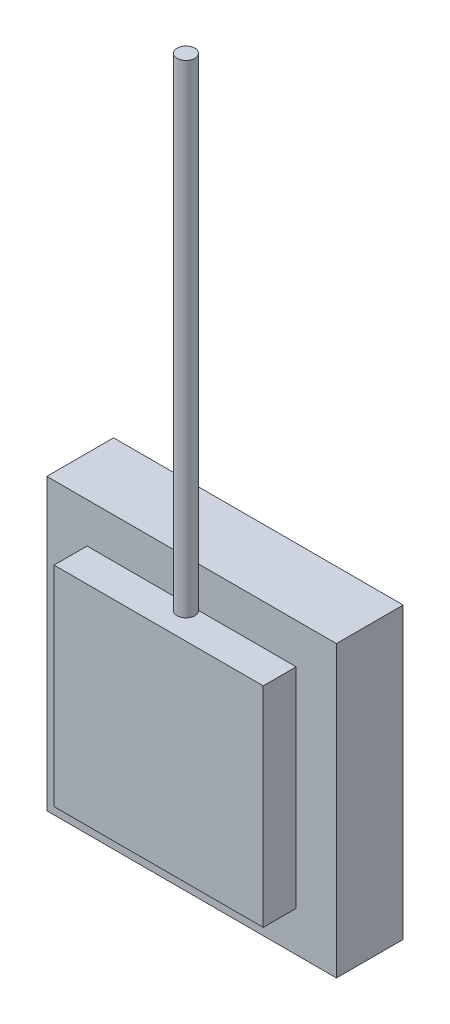
ISO-10303-21;
HEADER;
FILE_DESCRIPTION(('STEP AP214'),'2;1');
FILE_NAME('part.step','',(''),(''),'','','');
FILE_SCHEMA(('AUTOMOTIVE_DESIGN { 1 0 10303 214 1 1 1 1 }'));
ENDSEC;
DATA;
#1=APPLICATION_CONTEXT('core data for automotive mechanical design processes');
#2=APPLICATION_PROTOCOL_DEFINITION('international standard','automotive_design',2000,#1);
#3=PRODUCT_CONTEXT('',#1,'mechanical');
#4=PRODUCT('Part','Part','',(#3));
#5=PRODUCT_RELATED_PRODUCT_CATEGORY('part','',(#4));
#6=PRODUCT_DEFINITION_FORMATION('','',#4);
#7=PRODUCT_DEFINITION_CONTEXT('part definition',#1,'design');
#8=PRODUCT_DEFINITION('design','',#6,#7);
#9=PRODUCT_DEFINITION_SHAPE('','',#8);
#10=(LENGTH_UNIT() NAMED_UNIT(*) SI_UNIT(.MILLI.,.METRE.));
#11=(NAMED_UNIT(*) PLANE_ANGLE_UNIT() SI_UNIT($,.RADIAN.));
#12=(NAMED_UNIT(*) SI_UNIT($,.STERADIAN.) SOLID_ANGLE_UNIT());
#13=UNCERTAINTY_MEASURE_WITH_UNIT(LENGTH_MEASURE(1.E-05),#10,'distance_accuracy_value','');
#14=(GEOMETRIC_REPRESENTATION_CONTEXT(3) GLOBAL_UNCERTAINTY_ASSIGNED_CONTEXT((#13)) GLOBAL_UNIT_ASSIGNED_CONTEXT((#10,
#11,#12)) REPRESENTATION_CONTEXT('',''));
#15=CARTESIAN_POINT('',(0.,0.,0.));
#16=DIRECTION('',(0.,0.,1.));
#17=DIRECTION('',(1.,0.,0.));
#18=AXIS2_PLACEMENT_3D('',#15,#16,#17);
#19=CARTESIAN_POINT('',(0.,0.,4.15));
#20=DIRECTION('',(0.,0.,-1.));
#21=DIRECTION('',(-1.,0.,0.));
#22=AXIS2_PLACEMENT_3D('',#19,#20,#21);
#23=PLANE('',#22);
#24=DIRECTION('',(0.,-1.,0.));
#25=VECTOR('',#24,1.);
#26=CARTESIAN_POINT('',(9.42776641817179,45.5,4.15));
#27=LINE('',#26,#25);
#28=CARTESIAN_POINT('',(9.42776641817179,15.5,4.15));
#29=VERTEX_POINT('',#28);
#30=CARTESIAN_POINT('',(9.42776641817179,18.,4.15));
#31=VERTEX_POINT('',#30);
#32=EDGE_CURVE('E124',#29,#31,#27,.F.);
#33=ORIENTED_EDGE('',*,*,#32,.F.);
#34=DIRECTION('',(-1.,0.,0.));
#35=VECTOR('',#34,1.);
#36=CARTESIAN_POINT('',(2.5,15.5,4.15));
#37=LINE('',#36,#35);
#38=CARTESIAN_POINT('',(15.5,15.5,4.15));
#39=VERTEX_POINT('',#38);
#40=EDGE_CURVE('E113',#39,#29,#37,.T.);
#41=ORIENTED_EDGE('',*,*,#40,.F.);
#42=DIRECTION('',(0.,1.,0.));
#43=VECTOR('',#42,1.);
#44=CARTESIAN_POINT('',(15.5,15.5,4.15));
#45=LINE('',#44,#43);
#46=CARTESIAN_POINT('',(15.5,2.5,4.15));
#47=VERTEX_POINT('',#46);
#48=EDGE_CURVE('E155',#47,#39,#45,.T.);
#49=ORIENTED_EDGE('',*,*,#48,.F.);
#50=DIRECTION('',(1.,0.,0.));
#51=VECTOR('',#50,1.);
#52=CARTESIAN_POINT('',(2.5,2.5,4.15));
#53=LINE('',#52,#51);
#54=CARTESIAN_POINT('',(2.5,2.5,4.15));
#55=VERTEX_POINT('',#54);
#56=EDGE_CURVE('E152',#55,#47,#53,.T.);
#57=ORIENTED_EDGE('',*,*,#56,.F.);
#58=DIRECTION('',(0.,-1.,0.));
#59=VECTOR('',#58,1.);
#60=CARTESIAN_POINT('',(2.5,15.5,4.15));
#61=LINE('',#60,#59);
#62=CARTESIAN_POINT('',(2.5,15.5,4.15));
#63=VERTEX_POINT('',#62);
#64=EDGE_CURVE('E138',#63,#55,#61,.T.);
#65=ORIENTED_EDGE('',*,*,#64,.F.);
#66=CARTESIAN_POINT('',(8.67148678845415,15.5,4.15));
#67=VERTEX_POINT('',#66);
#68=EDGE_CURVE('E121',#67,#63,#37,.T.);
#69=ORIENTED_EDGE('',*,*,#68,.F.);
#70=DIRECTION('',(0.,-1.,0.));
#71=VECTOR('',#70,1.);
#72=CARTESIAN_POINT('',(8.67148678845415,45.5,4.15));
#73=LINE('',#72,#71);
#74=CARTESIAN_POINT('',(8.67148678845415,18.,4.15));
#75=VERTEX_POINT('',#74);
#76=EDGE_CURVE('E50',#75,#67,#73,.T.);
#77=ORIENTED_EDGE('',*,*,#76,.F.);
#78=DIRECTION('',(-1.,0.,0.));
#79=VECTOR('',#78,1.);
#80=CARTESIAN_POINT('',(0.,18.,4.15));
#81=LINE('',#80,#79);
#82=CARTESIAN_POINT('',(0.,18.,4.15));
#83=VERTEX_POINT('',#82);
#84=EDGE_CURVE('E175',#75,#83,#81,.T.);
#85=ORIENTED_EDGE('',*,*,#84,.T.);
#86=DIRECTION('',(0.,-1.,0.));
#87=VECTOR('',#86,1.);
#88=CARTESIAN_POINT('',(0.,0.,4.15));
#89=LINE('',#88,#87);
#90=CARTESIAN_POINT('',(0.,0.,4.15));
#91=VERTEX_POINT('',#90);
#92=EDGE_CURVE('E167',#83,#91,#89,.T.);
#93=ORIENTED_EDGE('',*,*,#92,.T.);
#94=DIRECTION('',(1.,0.,0.));
#95=VECTOR('',#94,1.);
#96=CARTESIAN_POINT('',(0.,0.,4.15));
#97=LINE('',#96,#95);
#98=CARTESIAN_POINT('',(18.,0.,4.15));
#99=VERTEX_POINT('',#98);
#100=EDGE_CURVE('E170',#91,#99,#97,.T.);
#101=ORIENTED_EDGE('',*,*,#100,.T.);
#102=DIRECTION('',(0.,1.,0.));
#103=VECTOR('',#102,1.);
#104=CARTESIAN_POINT('',(18.,0.,4.15));
#105=LINE('',#104,#103);
#106=CARTESIAN_POINT('',(18.,18.,4.15));
#107=VERTEX_POINT('',#106);
#108=EDGE_CURVE('E173',#99,#107,#105,.T.);
#109=ORIENTED_EDGE('',*,*,#108,.T.);
#110=EDGE_CURVE('E125',#107,#31,#81,.T.);
#111=ORIENTED_EDGE('',*,*,#110,.T.);
#112=EDGE_LOOP('',(#33,#41,#49,#57,#65,#69,#77,#85,#93,#101,#109,#111));
#113=FACE_BOUND('',#112,.T.);
#114=ADVANCED_FACE('F35',(#113),#23,.F.);
#115=CARTESIAN_POINT('',(0.,0.,4.15));
#116=DIRECTION('',(1.,0.,0.));
#117=DIRECTION('',(0.,0.,-1.));
#118=AXIS2_PLACEMENT_3D('',#115,#116,#117);
#119=PLANE('',#118);
#120=DIRECTION('',(0.,-1.,0.));
#121=VECTOR('',#120,1.);
#122=CARTESIAN_POINT('',(0.,0.,0.));
#123=LINE('',#122,#121);
#124=CARTESIAN_POINT('',(0.,18.,0.));
#125=VERTEX_POINT('',#124);
#126=CARTESIAN_POINT('',(0.,0.,0.));
#127=VERTEX_POINT('',#126);
#128=EDGE_CURVE('E166',#125,#127,#123,.T.);
#129=ORIENTED_EDGE('',*,*,#128,.T.);
#130=DIRECTION('',(0.,0.,-1.));
#131=VECTOR('',#130,1.);
#132=CARTESIAN_POINT('',(0.,0.,4.15));
#133=LINE('',#132,#131);
#134=EDGE_CURVE('E43',#91,#127,#133,.T.);
#135=ORIENTED_EDGE('',*,*,#134,.F.);
#136=ORIENTED_EDGE('',*,*,#92,.F.);
#137=DIRECTION('',(0.,0.,-1.));
#138=VECTOR('',#137,1.);
#139=CARTESIAN_POINT('',(0.,18.,4.15));
#140=LINE('',#139,#138);
#141=EDGE_CURVE('E177',#83,#125,#140,.T.);
#142=ORIENTED_EDGE('',*,*,#141,.T.);
#143=EDGE_LOOP('',(#129,#135,#136,#142));
#144=FACE_BOUND('',#143,.T.);
#145=ADVANCED_FACE('F37',(#144),#119,.F.);
#146=CARTESIAN_POINT('',(0.,0.,4.15));
#147=DIRECTION('',(0.,1.,0.));
#148=DIRECTION('',(0.,0.,1.));
#149=AXIS2_PLACEMENT_3D('',#146,#147,#148);
#150=PLANE('',#149);
#151=DIRECTION('',(1.,0.,0.));
#152=VECTOR('',#151,1.);
#153=CARTESIAN_POINT('',(0.,0.,0.));
#154=LINE('',#153,#152);
#155=CARTESIAN_POINT('',(18.,0.,0.));
#156=VERTEX_POINT('',#155);
#157=EDGE_CURVE('E180',#127,#156,#154,.T.);
#158=ORIENTED_EDGE('',*,*,#157,.T.);
#159=DIRECTION('',(0.,0.,-1.));
#160=VECTOR('',#159,1.);
#161=CARTESIAN_POINT('',(18.,0.,4.15));
#162=LINE('',#161,#160);
#163=EDGE_CURVE('E190',#99,#156,#162,.T.);
#164=ORIENTED_EDGE('',*,*,#163,.F.);
#165=ORIENTED_EDGE('',*,*,#100,.F.);
#166=ORIENTED_EDGE('',*,*,#134,.T.);
#167=EDGE_LOOP('',(#158,#164,#165,#166));
#168=FACE_BOUND('',#167,.T.);
#169=ADVANCED_FACE('F195',(#168),#150,.F.);
#170=CARTESIAN_POINT('',(18.,0.,4.15));
#171=DIRECTION('',(-1.,0.,0.));
#172=DIRECTION('',(0.,0.,1.));
#173=AXIS2_PLACEMENT_3D('',#170,#171,#172);
#174=PLANE('',#173);
#175=DIRECTION('',(0.,1.,0.));
#176=VECTOR('',#175,1.);
#177=CARTESIAN_POINT('',(18.,0.,0.));
#178=LINE('',#177,#176);
#179=CARTESIAN_POINT('',(18.,18.,0.));
#180=VERTEX_POINT('',#179);
#181=EDGE_CURVE('E182',#156,#180,#178,.T.);
#182=ORIENTED_EDGE('',*,*,#181,.T.);
#183=DIRECTION('',(0.,0.,-1.));
#184=VECTOR('',#183,1.);
#185=CARTESIAN_POINT('',(18.,18.,4.15));
#186=LINE('',#185,#184);
#187=EDGE_CURVE('E187',#107,#180,#186,.T.);
#188=ORIENTED_EDGE('',*,*,#187,.F.);
#189=ORIENTED_EDGE('',*,*,#108,.F.);
#190=ORIENTED_EDGE('',*,*,#163,.T.);
#191=EDGE_LOOP('',(#182,#188,#189,#190));
#192=FACE_BOUND('',#191,.T.);
#193=ADVANCED_FACE('F207',(#192),#174,.F.);
#194=CARTESIAN_POINT('',(0.,18.,4.15));
#195=DIRECTION('',(0.,-1.,0.));
#196=DIRECTION('',(0.,0.,-1.));
#197=AXIS2_PLACEMENT_3D('',#194,#195,#196);
#198=PLANE('',#197);
#199=CARTESIAN_POINT('',(9.04962660331297,18.,4.55163239860488));
#200=DIRECTION('',(0.,-1.,0.));
#201=DIRECTION('',(0.,0.,-1.));
#202=AXIS2_PLACEMENT_3D('',#199,#200,#201);
#203=CIRCLE('',#202,0.551632398604884);
#204=EDGE_CURVE('E57',#31,#75,#203,.F.);
#205=ORIENTED_EDGE('',*,*,#204,.F.);
#206=ORIENTED_EDGE('',*,*,#110,.F.);
#207=ORIENTED_EDGE('',*,*,#187,.T.);
#208=DIRECTION('',(-1.,0.,0.));
#209=VECTOR('',#208,1.);
#210=CARTESIAN_POINT('',(0.,18.,0.));
#211=LINE('',#210,#209);
#212=EDGE_CURVE('E171',#180,#125,#211,.T.);
#213=ORIENTED_EDGE('',*,*,#212,.T.);
#214=ORIENTED_EDGE('',*,*,#141,.F.);
#215=ORIENTED_EDGE('',*,*,#84,.F.);
#216=EDGE_LOOP('',(#205,#206,#207,#213,#214,#215));
#217=FACE_BOUND('',#216,.T.);
#218=ADVANCED_FACE('F209',(#217),#198,.F.);
#219=CARTESIAN_POINT('',(0.,0.,0.));
#220=DIRECTION('',(0.,0.,-1.));
#221=DIRECTION('',(-1.,0.,0.));
#222=AXIS2_PLACEMENT_3D('',#219,#220,#221);
#223=PLANE('',#222);
#224=CARTESIAN_POINT('',(10.,9.,0.));
#225=DIRECTION('',(0.,0.,-1.));
#226=DIRECTION('',(-1.,0.,0.));
#227=AXIS2_PLACEMENT_3D('',#224,#225,#226);
#228=CIRCLE('',#227,1.5);
#229=CARTESIAN_POINT('',(8.5,9.,0.));
#230=VERTEX_POINT('',#229);
#231=EDGE_CURVE('E127',#230,#230,#228,.T.);
#232=ORIENTED_EDGE('',*,*,#231,.F.);
#233=EDGE_LOOP('',(#232));
#234=FACE_BOUND('',#233,.T.);
#235=ORIENTED_EDGE('',*,*,#128,.F.);
#236=ORIENTED_EDGE('',*,*,#212,.F.);
#237=ORIENTED_EDGE('',*,*,#181,.F.);
#238=ORIENTED_EDGE('',*,*,#157,.F.);
#239=EDGE_LOOP('',(#235,#236,#237,#238));
#240=FACE_BOUND('',#239,.T.);
#241=ADVANCED_FACE('F203',(#234,#240),#223,.T.);
#242=CARTESIAN_POINT('',(2.5,15.5,6.2));
#243=DIRECTION('',(1.,0.,0.));
#244=DIRECTION('',(0.,0.,-1.));
#245=AXIS2_PLACEMENT_3D('',#242,#243,#244);
#246=PLANE('',#245);
#247=ORIENTED_EDGE('',*,*,#64,.T.);
#248=DIRECTION('',(0.,0.,-1.));
#249=VECTOR('',#248,1.);
#250=CARTESIAN_POINT('',(2.5,2.5,6.2));
#251=LINE('',#250,#249);
#252=CARTESIAN_POINT('',(2.5,2.5,6.2));
#253=VERTEX_POINT('',#252);
#254=EDGE_CURVE('E163',#253,#55,#251,.T.);
#255=ORIENTED_EDGE('',*,*,#254,.F.);
#256=DIRECTION('',(0.,-1.,0.));
#257=VECTOR('',#256,1.);
#258=CARTESIAN_POINT('',(2.5,15.5,6.2));
#259=LINE('',#258,#257);
#260=CARTESIAN_POINT('',(2.5,15.5,6.2));
#261=VERTEX_POINT('',#260);
#262=EDGE_CURVE('E120',#261,#253,#259,.T.);
#263=ORIENTED_EDGE('',*,*,#262,.F.);
#264=DIRECTION('',(0.,0.,-1.));
#265=VECTOR('',#264,1.);
#266=CARTESIAN_POINT('',(2.5,15.5,6.2));
#267=LINE('',#266,#265);
#268=EDGE_CURVE('E149',#261,#63,#267,.T.);
#269=ORIENTED_EDGE('',*,*,#268,.T.);
#270=EDGE_LOOP('',(#247,#255,#263,#269));
#271=FACE_BOUND('',#270,.T.);
#272=ADVANCED_FACE('F216',(#271),#246,.F.);
#273=CARTESIAN_POINT('',(2.5,2.5,6.2));
#274=DIRECTION('',(0.,1.,0.));
#275=DIRECTION('',(-1.,0.,0.));
#276=AXIS2_PLACEMENT_3D('',#273,#274,#275);
#277=PLANE('',#276);
#278=ORIENTED_EDGE('',*,*,#56,.T.);
#279=DIRECTION('',(0.,0.,-1.));
#280=VECTOR('',#279,1.);
#281=CARTESIAN_POINT('',(15.5,2.5,6.2));
#282=LINE('',#281,#280);
#283=CARTESIAN_POINT('',(15.5,2.5,6.2));
#284=VERTEX_POINT('',#283);
#285=EDGE_CURVE('E160',#284,#47,#282,.T.);
#286=ORIENTED_EDGE('',*,*,#285,.F.);
#287=DIRECTION('',(1.,0.,0.));
#288=VECTOR('',#287,1.);
#289=CARTESIAN_POINT('',(2.5,2.5,6.2));
#290=LINE('',#289,#288);
#291=EDGE_CURVE('E143',#253,#284,#290,.T.);
#292=ORIENTED_EDGE('',*,*,#291,.F.);
#293=ORIENTED_EDGE('',*,*,#254,.T.);
#294=EDGE_LOOP('',(#278,#286,#292,#293));
#295=FACE_BOUND('',#294,.T.);
#296=ADVANCED_FACE('F228',(#295),#277,.F.);
#297=CARTESIAN_POINT('',(15.5,15.5,6.2));
#298=DIRECTION('',(-1.,0.,0.));
#299=DIRECTION('',(0.,0.,1.));
#300=AXIS2_PLACEMENT_3D('',#297,#298,#299);
#301=PLANE('',#300);
#302=ORIENTED_EDGE('',*,*,#48,.T.);
#303=DIRECTION('',(0.,0.,-1.));
#304=VECTOR('',#303,1.);
#305=CARTESIAN_POINT('',(15.5,15.5,6.2));
#306=LINE('',#305,#304);
#307=CARTESIAN_POINT('',(15.5,15.5,6.2));
#308=VERTEX_POINT('',#307);
#309=EDGE_CURVE('E118',#308,#39,#306,.T.);
#310=ORIENTED_EDGE('',*,*,#309,.F.);
#311=DIRECTION('',(0.,1.,0.));
#312=VECTOR('',#311,1.);
#313=CARTESIAN_POINT('',(15.5,15.5,6.2));
#314=LINE('',#313,#312);
#315=EDGE_CURVE('E145',#284,#308,#314,.T.);
#316=ORIENTED_EDGE('',*,*,#315,.F.);
#317=ORIENTED_EDGE('',*,*,#285,.T.);
#318=EDGE_LOOP('',(#302,#310,#316,#317));
#319=FACE_BOUND('',#318,.T.);
#320=ADVANCED_FACE('F232',(#319),#301,.F.);
#321=CARTESIAN_POINT('',(2.5,15.5,6.2));
#322=DIRECTION('',(0.,-1.,0.));
#323=DIRECTION('',(0.,0.,-1.));
#324=AXIS2_PLACEMENT_3D('',#321,#322,#323);
#325=PLANE('',#324);
#326=CARTESIAN_POINT('',(9.04962660331297,15.5,4.55163239860488));
#327=DIRECTION('',(0.,-1.,0.));
#328=DIRECTION('',(0.,0.,-1.));
#329=AXIS2_PLACEMENT_3D('',#326,#327,#328);
#330=CIRCLE('',#329,0.551632398604884);
#331=EDGE_CURVE('E11',#67,#29,#330,.F.);
#332=ORIENTED_EDGE('',*,*,#331,.F.);
#333=ORIENTED_EDGE('',*,*,#68,.T.);
#334=ORIENTED_EDGE('',*,*,#268,.F.);
#335=DIRECTION('',(-1.,0.,0.));
#336=VECTOR('',#335,1.);
#337=CARTESIAN_POINT('',(2.5,15.5,6.2));
#338=LINE('',#337,#336);
#339=EDGE_CURVE('E147',#308,#261,#338,.T.);
#340=ORIENTED_EDGE('',*,*,#339,.F.);
#341=ORIENTED_EDGE('',*,*,#309,.T.);
#342=ORIENTED_EDGE('',*,*,#40,.T.);
#343=EDGE_LOOP('',(#332,#333,#334,#340,#341,#342));
#344=FACE_BOUND('',#343,.T.);
#345=ADVANCED_FACE('F115',(#344),#325,.F.);
#346=CARTESIAN_POINT('',(0.,0.,6.2));
#347=DIRECTION('',(0.,0.,1.));
#348=DIRECTION('',(1.,0.,0.));
#349=AXIS2_PLACEMENT_3D('',#346,#347,#348);
#350=PLANE('',#349);
#351=ORIENTED_EDGE('',*,*,#262,.T.);
#352=ORIENTED_EDGE('',*,*,#291,.T.);
#353=ORIENTED_EDGE('',*,*,#315,.T.);
#354=ORIENTED_EDGE('',*,*,#339,.T.);
#355=EDGE_LOOP('',(#351,#352,#353,#354));
#356=FACE_BOUND('',#355,.T.);
#357=ADVANCED_FACE('F239',(#356),#350,.T.);
#358=CARTESIAN_POINT('',(10.,9.,-0.5));
#359=DIRECTION('',(0.,0.,1.));
#360=DIRECTION('',(1.,0.,0.));
#361=AXIS2_PLACEMENT_3D('',#358,#359,#360);
#362=CYLINDRICAL_SURFACE('',#361,1.5);
#363=CARTESIAN_POINT('',(10.,9.,-0.5));
#364=DIRECTION('',(0.,0.,-1.));
#365=DIRECTION('',(-1.,0.,0.));
#366=AXIS2_PLACEMENT_3D('',#363,#364,#365);
#367=CIRCLE('',#366,1.5);
#368=CARTESIAN_POINT('',(8.5,9.,-0.5));
#369=VERTEX_POINT('',#368);
#370=EDGE_CURVE('E135',#369,#369,#367,.T.);
#371=ORIENTED_EDGE('',*,*,#370,.F.);
#372=EDGE_LOOP('',(#371));
#373=FACE_BOUND('',#372,.T.);
#374=ORIENTED_EDGE('',*,*,#231,.T.);
#375=EDGE_LOOP('',(#374));
#376=FACE_BOUND('',#375,.T.);
#377=ADVANCED_FACE('F242',(#373,#376),#362,.T.);
#378=CARTESIAN_POINT('',(10.,9.,-0.5));
#379=DIRECTION('',(0.,0.,-1.));
#380=DIRECTION('',(-1.,0.,0.));
#381=AXIS2_PLACEMENT_3D('',#378,#379,#380);
#382=PLANE('',#381);
#383=ORIENTED_EDGE('',*,*,#370,.T.);
#384=EDGE_LOOP('',(#383));
#385=FACE_BOUND('',#384,.T.);
#386=ADVANCED_FACE('F246',(#385),#382,.T.);
#387=CARTESIAN_POINT('',(9.04962660331297,45.5,4.55163239860488));
#388=DIRECTION('',(0.,-1.,0.));
#389=DIRECTION('',(0.,0.,-1.));
#390=AXIS2_PLACEMENT_3D('',#387,#388,#389);
#391=CYLINDRICAL_SURFACE('',#390,0.551632398604884);
#392=CARTESIAN_POINT('',(9.04962660331297,45.5,4.55163239860488));
#393=DIRECTION('',(0.,1.,0.));
#394=DIRECTION('',(0.,0.,1.));
#395=AXIS2_PLACEMENT_3D('',#392,#393,#394);
#396=CIRCLE('',#395,0.551632398604884);
#397=CARTESIAN_POINT('',(9.04962660331297,45.5,5.10326479720977));
#398=VERTEX_POINT('',#397);
#399=EDGE_CURVE('E131',#398,#398,#396,.T.);
#400=ORIENTED_EDGE('',*,*,#399,.F.);
#401=EDGE_LOOP('',(#400));
#402=FACE_BOUND('',#401,.T.);
#403=ORIENTED_EDGE('',*,*,#331,.T.);
#404=ORIENTED_EDGE('',*,*,#32,.T.);
#405=ORIENTED_EDGE('',*,*,#204,.T.);
#406=ORIENTED_EDGE('',*,*,#76,.T.);
#407=EDGE_LOOP('',(#403,#404,#405,#406));
#408=FACE_BOUND('',#407,.T.);
#409=ADVANCED_FACE('F129',(#402,#408),#391,.T.);
#410=CARTESIAN_POINT('',(9.04962660331297,45.5,4.55163239860488));
#411=DIRECTION('',(0.,1.,0.));
#412=DIRECTION('',(0.,0.,1.));
#413=AXIS2_PLACEMENT_3D('',#410,#411,#412);
#414=PLANE('',#413);
#415=ORIENTED_EDGE('',*,*,#399,.T.);
#416=EDGE_LOOP('',(#415));
#417=FACE_BOUND('',#416,.T.);
#418=ADVANCED_FACE('F253',(#417),#414,.T.);
#419=CLOSED_SHELL('',(#114,#145,#169,#193,#218,#241,#272,#296,#320,#345,#357,#377,#386,#409,#418));
#420=MANIFOLD_SOLID_BREP('B2',#419);
#421=ADVANCED_BREP_SHAPE_REPRESENTATION('',(#18,#420),#14);
#422=SHAPE_DEFINITION_REPRESENTATION(#9,#421);
ENDSEC;
END-ISO-10303-21;
